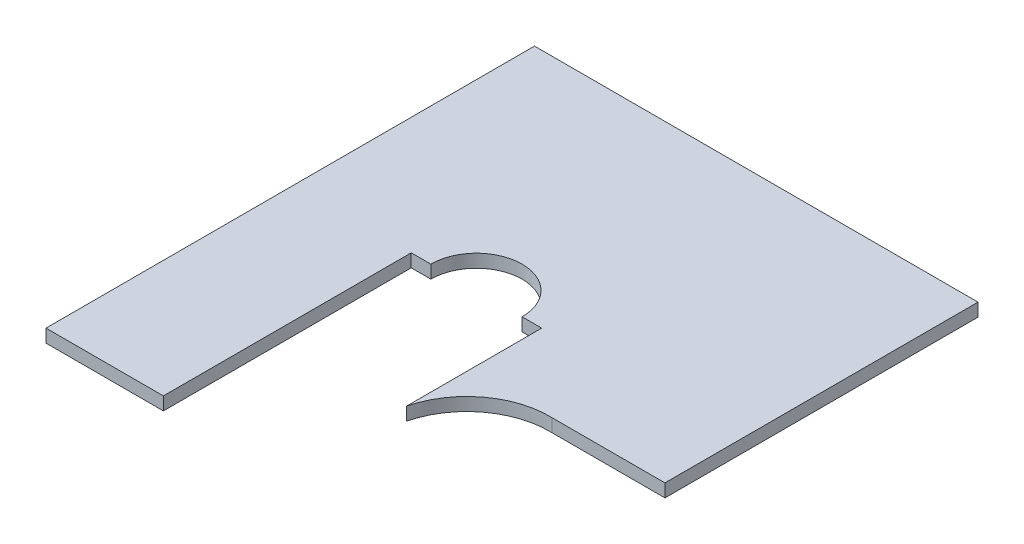
ISO-10303-21;
HEADER;
FILE_DESCRIPTION(('STEP AP214'),'2;1');
FILE_NAME('part.step','',(''),(''),'','','');
FILE_SCHEMA(('AUTOMOTIVE_DESIGN { 1 0 10303 214 1 1 1 1 }'));
ENDSEC;
DATA;
#1=APPLICATION_CONTEXT('core data for automotive mechanical design processes');
#2=APPLICATION_PROTOCOL_DEFINITION('international standard','automotive_design',2000,#1);
#3=PRODUCT_CONTEXT('',#1,'mechanical');
#4=PRODUCT('Part','Part','',(#3));
#5=PRODUCT_RELATED_PRODUCT_CATEGORY('part','',(#4));
#6=PRODUCT_DEFINITION_FORMATION('','',#4);
#7=PRODUCT_DEFINITION_CONTEXT('part definition',#1,'design');
#8=PRODUCT_DEFINITION('design','',#6,#7);
#9=PRODUCT_DEFINITION_SHAPE('','',#8);
#10=(LENGTH_UNIT() NAMED_UNIT(*) SI_UNIT(.MILLI.,.METRE.));
#11=(NAMED_UNIT(*) PLANE_ANGLE_UNIT() SI_UNIT($,.RADIAN.));
#12=(NAMED_UNIT(*) SI_UNIT($,.STERADIAN.) SOLID_ANGLE_UNIT());
#13=UNCERTAINTY_MEASURE_WITH_UNIT(LENGTH_MEASURE(1.E-05),#10,'distance_accuracy_value','');
#14=(GEOMETRIC_REPRESENTATION_CONTEXT(3) GLOBAL_UNCERTAINTY_ASSIGNED_CONTEXT((#13)) GLOBAL_UNIT_ASSIGNED_CONTEXT((#10,
#11,#12)) REPRESENTATION_CONTEXT('',''));
#15=CARTESIAN_POINT('',(0.,0.,0.));
#16=DIRECTION('',(0.,0.,1.));
#17=DIRECTION('',(1.,0.,0.));
#18=AXIS2_PLACEMENT_3D('',#15,#16,#17);
#19=CARTESIAN_POINT('',(-8.02288626733294,0.25,-28.8935870349217));
#20=DIRECTION('',(0.,-1.,0.));
#21=DIRECTION('',(0.,0.,-1.));
#22=AXIS2_PLACEMENT_3D('',#19,#20,#21);
#23=CYLINDRICAL_SURFACE('',#22,1.75);
#24=CARTESIAN_POINT('',(-8.02288626733294,-0.25,-28.8935870349217));
#25=DIRECTION('',(0.,-1.,0.));
#26=DIRECTION('',(0.,0.,1.));
#27=AXIS2_PLACEMENT_3D('',#24,#25,#26);
#28=CIRCLE('',#27,1.75);
#29=CARTESIAN_POINT('',(-9.77288626733294,-0.25,-28.8935870349217));
#30=VERTEX_POINT('',#29);
#31=CARTESIAN_POINT('',(-6.27288626733294,-0.25,-28.8935870349217));
#32=VERTEX_POINT('',#31);
#33=EDGE_CURVE('E158',#30,#32,#28,.T.);
#34=ORIENTED_EDGE('',*,*,#33,.T.);
#35=DIRECTION('',(0.,-1.,0.));
#36=VECTOR('',#35,1.);
#37=CARTESIAN_POINT('',(-6.27288626733294,0.25,-28.8935870349217));
#38=LINE('',#37,#36);
#39=CARTESIAN_POINT('',(-6.27288626733294,0.25,-28.8935870349217));
#40=VERTEX_POINT('',#39);
#41=EDGE_CURVE('E11',#40,#32,#38,.T.);
#42=ORIENTED_EDGE('',*,*,#41,.F.);
#43=CARTESIAN_POINT('',(-8.02288626733294,0.25,-28.8935870349217));
#44=DIRECTION('',(0.,-1.,0.));
#45=DIRECTION('',(0.,0.,1.));
#46=AXIS2_PLACEMENT_3D('',#43,#44,#45);
#47=CIRCLE('',#46,1.75);
#48=CARTESIAN_POINT('',(-9.77288626733294,0.25,-28.8935870349217));
#49=VERTEX_POINT('',#48);
#50=EDGE_CURVE('E189',#49,#40,#47,.T.);
#51=ORIENTED_EDGE('',*,*,#50,.F.);
#52=DIRECTION('',(0.,-1.,0.));
#53=VECTOR('',#52,1.);
#54=CARTESIAN_POINT('',(-9.77288626733294,0.25,-28.8935870349217));
#55=LINE('',#54,#53);
#56=EDGE_CURVE('E154',#49,#30,#55,.T.);
#57=ORIENTED_EDGE('',*,*,#56,.T.);
#58=EDGE_LOOP('',(#34,#42,#51,#57));
#59=FACE_BOUND('',#58,.T.);
#60=ADVANCED_FACE('F39',(#59),#23,.F.);
#61=CARTESIAN_POINT('',(-6.27288626733294,0.25,-28.8935870349217));
#62=DIRECTION('',(0.,0.,-1.));
#63=DIRECTION('',(-1.,0.,0.));
#64=AXIS2_PLACEMENT_3D('',#61,#62,#63);
#65=PLANE('',#64);
#66=DIRECTION('',(1.,0.,0.));
#67=VECTOR('',#66,1.);
#68=CARTESIAN_POINT('',(-6.27288626733294,-0.25,-28.8935870349217));
#69=LINE('',#68,#67);
#70=CARTESIAN_POINT('',(-5.52288626733294,-0.25,-28.8935870349217));
#71=VERTEX_POINT('',#70);
#72=EDGE_CURVE('E162',#32,#71,#69,.T.);
#73=ORIENTED_EDGE('',*,*,#72,.T.);
#74=DIRECTION('',(0.,-1.,0.));
#75=VECTOR('',#74,1.);
#76=CARTESIAN_POINT('',(-5.52288626733294,0.25,-28.8935870349217));
#77=LINE('',#76,#75);
#78=CARTESIAN_POINT('',(-5.52288626733294,0.25,-28.8935870349217));
#79=VERTEX_POINT('',#78);
#80=EDGE_CURVE('E48',#79,#71,#77,.T.);
#81=ORIENTED_EDGE('',*,*,#80,.F.);
#82=DIRECTION('',(1.,0.,0.));
#83=VECTOR('',#82,1.);
#84=CARTESIAN_POINT('',(-6.27288626733294,0.25,-28.8935870349217));
#85=LINE('',#84,#83);
#86=EDGE_CURVE('E108',#40,#79,#85,.T.);
#87=ORIENTED_EDGE('',*,*,#86,.F.);
#88=ORIENTED_EDGE('',*,*,#41,.T.);
#89=EDGE_LOOP('',(#73,#81,#87,#88));
#90=FACE_BOUND('',#89,.T.);
#91=ADVANCED_FACE('F275',(#90),#65,.F.);
#92=CARTESIAN_POINT('',(-5.52288626733294,0.25,-28.8935870349217));
#93=DIRECTION('',(1.,0.,0.));
#94=DIRECTION('',(0.,0.,-1.));
#95=AXIS2_PLACEMENT_3D('',#92,#93,#94);
#96=PLANE('',#95);
#97=DIRECTION('',(0.,0.,1.));
#98=VECTOR('',#97,1.);
#99=CARTESIAN_POINT('',(-5.52288626733294,-0.25,-28.8935870349217));
#100=LINE('',#99,#98);
#101=CARTESIAN_POINT('',(-5.52288626733294,-0.25,-23.7185870349217));
#102=VERTEX_POINT('',#101);
#103=EDGE_CURVE('E165',#71,#102,#100,.T.);
#104=ORIENTED_EDGE('',*,*,#103,.T.);
#105=DIRECTION('',(0.,-1.,0.));
#106=VECTOR('',#105,1.);
#107=CARTESIAN_POINT('',(-5.52288626733294,0.25,-23.7185870349217));
#108=LINE('',#107,#106);
#109=CARTESIAN_POINT('',(-5.52288626733294,0.25,-23.7185870349217));
#110=VERTEX_POINT('',#109);
#111=EDGE_CURVE('E212',#110,#102,#108,.T.);
#112=ORIENTED_EDGE('',*,*,#111,.F.);
#113=DIRECTION('',(0.,0.,1.));
#114=VECTOR('',#113,1.);
#115=CARTESIAN_POINT('',(-5.52288626733294,0.25,-28.8935870349217));
#116=LINE('',#115,#114);
#117=EDGE_CURVE('E222',#79,#110,#116,.T.);
#118=ORIENTED_EDGE('',*,*,#117,.F.);
#119=ORIENTED_EDGE('',*,*,#80,.T.);
#120=EDGE_LOOP('',(#104,#112,#118,#119));
#121=FACE_BOUND('',#120,.T.);
#122=ADVANCED_FACE('F220',(#121),#96,.F.);
#123=CARTESIAN_POINT('',(-2.44352375226658,0.25,-22.9451844872118));
#124=DIRECTION('',(0.,-1.,0.));
#125=DIRECTION('',(0.,0.,-1.));
#126=AXIS2_PLACEMENT_3D('',#123,#124,#125);
#127=CYLINDRICAL_SURFACE('',#126,3.175);
#128=CARTESIAN_POINT('',(-2.44352375226658,-0.25,-22.9451844872118));
#129=DIRECTION('',(0.,-1.,0.));
#130=DIRECTION('',(0.,0.,1.));
#131=AXIS2_PLACEMENT_3D('',#128,#129,#130);
#132=CIRCLE('',#131,3.175);
#133=CARTESIAN_POINT('',(-2.34788626733293,-0.25,-26.1187437621388));
#134=VERTEX_POINT('',#133);
#135=EDGE_CURVE('E168',#102,#134,#132,.T.);
#136=ORIENTED_EDGE('',*,*,#135,.T.);
#137=DIRECTION('',(0.,-1.,0.));
#138=VECTOR('',#137,1.);
#139=CARTESIAN_POINT('',(-2.34788626733293,0.25,-26.1187437621388));
#140=LINE('',#139,#138);
#141=CARTESIAN_POINT('',(-2.34788626733293,0.25,-26.1187437621388));
#142=VERTEX_POINT('',#141);
#143=EDGE_CURVE('E208',#142,#134,#140,.T.);
#144=ORIENTED_EDGE('',*,*,#143,.F.);
#145=CARTESIAN_POINT('',(-2.44352375226658,0.25,-22.9451844872118));
#146=DIRECTION('',(0.,-1.,0.));
#147=DIRECTION('',(0.,0.,1.));
#148=AXIS2_PLACEMENT_3D('',#145,#146,#147);
#149=CIRCLE('',#148,3.175);
#150=EDGE_CURVE('E241',#110,#142,#149,.T.);
#151=ORIENTED_EDGE('',*,*,#150,.F.);
#152=ORIENTED_EDGE('',*,*,#111,.T.);
#153=EDGE_LOOP('',(#136,#144,#151,#152));
#154=FACE_BOUND('',#153,.T.);
#155=ADVANCED_FACE('F231',(#154),#127,.F.);
#156=CARTESIAN_POINT('',(-2.34788626733293,0.25,-26.1187437621388));
#157=DIRECTION('',(0.,0.,-1.));
#158=DIRECTION('',(-1.,0.,0.));
#159=AXIS2_PLACEMENT_3D('',#156,#157,#158);
#160=PLANE('',#159);
#161=DIRECTION('',(1.,0.,0.));
#162=VECTOR('',#161,1.);
#163=CARTESIAN_POINT('',(-2.34788626733293,-0.25,-26.1187437621388));
#164=LINE('',#163,#162);
#165=CARTESIAN_POINT('',(1.97711373266706,-0.25,-26.1187437621388));
#166=VERTEX_POINT('',#165);
#167=EDGE_CURVE('E171',#134,#166,#164,.T.);
#168=ORIENTED_EDGE('',*,*,#167,.T.);
#169=DIRECTION('',(0.,-1.,0.));
#170=VECTOR('',#169,1.);
#171=CARTESIAN_POINT('',(1.97711373266706,0.25,-26.1187437621388));
#172=LINE('',#171,#170);
#173=CARTESIAN_POINT('',(1.97711373266706,0.25,-26.1187437621388));
#174=VERTEX_POINT('',#173);
#175=EDGE_CURVE('E204',#174,#166,#172,.T.);
#176=ORIENTED_EDGE('',*,*,#175,.F.);
#177=DIRECTION('',(1.,0.,0.));
#178=VECTOR('',#177,1.);
#179=CARTESIAN_POINT('',(-2.34788626733293,0.25,-26.1187437621388));
#180=LINE('',#179,#178);
#181=EDGE_CURVE('E237',#142,#174,#180,.T.);
#182=ORIENTED_EDGE('',*,*,#181,.F.);
#183=ORIENTED_EDGE('',*,*,#143,.T.);
#184=EDGE_LOOP('',(#168,#176,#182,#183));
#185=FACE_BOUND('',#184,.T.);
#186=ADVANCED_FACE('F235',(#185),#160,.F.);
#187=CARTESIAN_POINT('',(1.97711373266706,0.25,-26.1187437621388));
#188=DIRECTION('',(-1.,0.,0.));
#189=DIRECTION('',(0.,0.,1.));
#190=AXIS2_PLACEMENT_3D('',#187,#188,#189);
#191=PLANE('',#190);
#192=DIRECTION('',(0.,0.,-1.));
#193=VECTOR('',#192,1.);
#194=CARTESIAN_POINT('',(1.97711373266706,-0.25,-26.1187437621388));
#195=LINE('',#194,#193);
#196=CARTESIAN_POINT('',(1.97711373266706,-0.25,-38.1187437621388));
#197=VERTEX_POINT('',#196);
#198=EDGE_CURVE('E174',#166,#197,#195,.T.);
#199=ORIENTED_EDGE('',*,*,#198,.T.);
#200=DIRECTION('',(0.,-1.,0.));
#201=VECTOR('',#200,1.);
#202=CARTESIAN_POINT('',(1.97711373266706,0.25,-38.1187437621388));
#203=LINE('',#202,#201);
#204=CARTESIAN_POINT('',(1.97711373266706,0.25,-38.1187437621388));
#205=VERTEX_POINT('',#204);
#206=EDGE_CURVE('E200',#205,#197,#203,.T.);
#207=ORIENTED_EDGE('',*,*,#206,.F.);
#208=DIRECTION('',(0.,0.,-1.));
#209=VECTOR('',#208,1.);
#210=CARTESIAN_POINT('',(1.97711373266706,0.25,-26.1187437621388));
#211=LINE('',#210,#209);
#212=EDGE_CURVE('E240',#174,#205,#211,.T.);
#213=ORIENTED_EDGE('',*,*,#212,.F.);
#214=ORIENTED_EDGE('',*,*,#175,.T.);
#215=EDGE_LOOP('',(#199,#207,#213,#214));
#216=FACE_BOUND('',#215,.T.);
#217=ADVANCED_FACE('F288',(#216),#191,.F.);
#218=CARTESIAN_POINT('',(1.97711373266706,0.25,-38.1187437621388));
#219=DIRECTION('',(0.,0.,1.));
#220=DIRECTION('',(1.,0.,0.));
#221=AXIS2_PLACEMENT_3D('',#218,#219,#220);
#222=PLANE('',#221);
#223=DIRECTION('',(-1.,0.,0.));
#224=VECTOR('',#223,1.);
#225=CARTESIAN_POINT('',(1.97711373266706,-0.25,-38.1187437621388));
#226=LINE('',#225,#224);
#227=CARTESIAN_POINT('',(-15.0228862673329,-0.25,-38.1187437621388));
#228=VERTEX_POINT('',#227);
#229=EDGE_CURVE('E177',#197,#228,#226,.T.);
#230=ORIENTED_EDGE('',*,*,#229,.T.);
#231=DIRECTION('',(0.,-1.,0.));
#232=VECTOR('',#231,1.);
#233=CARTESIAN_POINT('',(-15.0228862673329,0.25,-38.1187437621388));
#234=LINE('',#233,#232);
#235=CARTESIAN_POINT('',(-15.0228862673329,0.25,-38.1187437621388));
#236=VERTEX_POINT('',#235);
#237=EDGE_CURVE('E196',#236,#228,#234,.T.);
#238=ORIENTED_EDGE('',*,*,#237,.F.);
#239=DIRECTION('',(-1.,0.,0.));
#240=VECTOR('',#239,1.);
#241=CARTESIAN_POINT('',(1.97711373266706,0.25,-38.1187437621388));
#242=LINE('',#241,#240);
#243=EDGE_CURVE('E245',#205,#236,#242,.T.);
#244=ORIENTED_EDGE('',*,*,#243,.F.);
#245=ORIENTED_EDGE('',*,*,#206,.T.);
#246=EDGE_LOOP('',(#230,#238,#244,#245));
#247=FACE_BOUND('',#246,.T.);
#248=ADVANCED_FACE('F256',(#247),#222,.F.);
#249=CARTESIAN_POINT('',(-15.0228862673329,0.25,-38.1187437621388));
#250=DIRECTION('',(1.,0.,0.));
#251=DIRECTION('',(0.,0.,-1.));
#252=AXIS2_PLACEMENT_3D('',#249,#250,#251);
#253=PLANE('',#252);
#254=DIRECTION('',(0.,0.,1.));
#255=VECTOR('',#254,1.);
#256=CARTESIAN_POINT('',(-15.0228862673329,-0.25,-38.1187437621388));
#257=LINE('',#256,#255);
#258=CARTESIAN_POINT('',(-15.0228862673329,-0.25,-19.3935870349217));
#259=VERTEX_POINT('',#258);
#260=EDGE_CURVE('E180',#228,#259,#257,.T.);
#261=ORIENTED_EDGE('',*,*,#260,.T.);
#262=DIRECTION('',(0.,-1.,0.));
#263=VECTOR('',#262,1.);
#264=CARTESIAN_POINT('',(-15.0228862673329,0.25,-19.3935870349217));
#265=LINE('',#264,#263);
#266=CARTESIAN_POINT('',(-15.0228862673329,0.25,-19.3935870349217));
#267=VERTEX_POINT('',#266);
#268=EDGE_CURVE('E147',#267,#259,#265,.T.);
#269=ORIENTED_EDGE('',*,*,#268,.F.);
#270=DIRECTION('',(0.,0.,1.));
#271=VECTOR('',#270,1.);
#272=CARTESIAN_POINT('',(-15.0228862673329,0.25,-38.1187437621388));
#273=LINE('',#272,#271);
#274=EDGE_CURVE('E136',#236,#267,#273,.T.);
#275=ORIENTED_EDGE('',*,*,#274,.F.);
#276=ORIENTED_EDGE('',*,*,#237,.T.);
#277=EDGE_LOOP('',(#261,#269,#275,#276));
#278=FACE_BOUND('',#277,.T.);
#279=ADVANCED_FACE('F260',(#278),#253,.F.);
#280=CARTESIAN_POINT('',(-10.5228862673329,0.25,-19.3935870349217));
#281=DIRECTION('',(0.,0.,-1.));
#282=DIRECTION('',(-1.,0.,0.));
#283=AXIS2_PLACEMENT_3D('',#280,#281,#282);
#284=PLANE('',#283);
#285=DIRECTION('',(1.,0.,0.));
#286=VECTOR('',#285,1.);
#287=CARTESIAN_POINT('',(-10.5228862673329,-0.25,-19.3935870349217));
#288=LINE('',#287,#286);
#289=CARTESIAN_POINT('',(-10.5228862673329,-0.25,-19.3935870349217));
#290=VERTEX_POINT('',#289);
#291=EDGE_CURVE('E145',#259,#290,#288,.T.);
#292=ORIENTED_EDGE('',*,*,#291,.T.);
#293=DIRECTION('',(0.,-1.,0.));
#294=VECTOR('',#293,1.);
#295=CARTESIAN_POINT('',(-10.5228862673329,0.25,-19.3935870349217));
#296=LINE('',#295,#294);
#297=CARTESIAN_POINT('',(-10.5228862673329,0.25,-19.3935870349217));
#298=VERTEX_POINT('',#297);
#299=EDGE_CURVE('E142',#298,#290,#296,.T.);
#300=ORIENTED_EDGE('',*,*,#299,.F.);
#301=DIRECTION('',(1.,0.,0.));
#302=VECTOR('',#301,1.);
#303=CARTESIAN_POINT('',(-10.5228862673329,0.25,-19.3935870349217));
#304=LINE('',#303,#302);
#305=EDGE_CURVE('E130',#267,#298,#304,.T.);
#306=ORIENTED_EDGE('',*,*,#305,.F.);
#307=ORIENTED_EDGE('',*,*,#268,.T.);
#308=EDGE_LOOP('',(#292,#300,#306,#307));
#309=FACE_BOUND('',#308,.T.);
#310=ADVANCED_FACE('F143',(#309),#284,.F.);
#311=CARTESIAN_POINT('',(-10.5228862673329,0.25,-28.8935870349217));
#312=DIRECTION('',(-1.,0.,0.));
#313=DIRECTION('',(0.,0.,1.));
#314=AXIS2_PLACEMENT_3D('',#311,#312,#313);
#315=PLANE('',#314);
#316=DIRECTION('',(0.,0.,-1.));
#317=VECTOR('',#316,1.);
#318=CARTESIAN_POINT('',(-10.5228862673329,-0.25,-28.8935870349217));
#319=LINE('',#318,#317);
#320=CARTESIAN_POINT('',(-10.5228862673329,-0.25,-28.8935870349217));
#321=VERTEX_POINT('',#320);
#322=EDGE_CURVE('E94',#290,#321,#319,.T.);
#323=ORIENTED_EDGE('',*,*,#322,.T.);
#324=DIRECTION('',(0.,-1.,0.));
#325=VECTOR('',#324,1.);
#326=CARTESIAN_POINT('',(-10.5228862673329,0.25,-28.8935870349217));
#327=LINE('',#326,#325);
#328=CARTESIAN_POINT('',(-10.5228862673329,0.25,-28.8935870349217));
#329=VERTEX_POINT('',#328);
#330=EDGE_CURVE('E148',#329,#321,#327,.T.);
#331=ORIENTED_EDGE('',*,*,#330,.F.);
#332=DIRECTION('',(0.,0.,-1.));
#333=VECTOR('',#332,1.);
#334=CARTESIAN_POINT('',(-10.5228862673329,0.25,-28.8935870349217));
#335=LINE('',#334,#333);
#336=EDGE_CURVE('E134',#298,#329,#335,.T.);
#337=ORIENTED_EDGE('',*,*,#336,.F.);
#338=ORIENTED_EDGE('',*,*,#299,.T.);
#339=EDGE_LOOP('',(#323,#331,#337,#338));
#340=FACE_BOUND('',#339,.T.);
#341=ADVANCED_FACE('F150',(#340),#315,.F.);
#342=CARTESIAN_POINT('',(-10.5228862673329,0.25,-28.8935870349217));
#343=DIRECTION('',(0.,0.,-1.));
#344=DIRECTION('',(-1.,0.,0.));
#345=AXIS2_PLACEMENT_3D('',#342,#343,#344);
#346=PLANE('',#345);
#347=DIRECTION('',(1.,0.,0.));
#348=VECTOR('',#347,1.);
#349=CARTESIAN_POINT('',(-10.5228862673329,-0.25,-28.8935870349217));
#350=LINE('',#349,#348);
#351=EDGE_CURVE('E100',#321,#30,#350,.T.);
#352=ORIENTED_EDGE('',*,*,#351,.T.);
#353=ORIENTED_EDGE('',*,*,#56,.F.);
#354=DIRECTION('',(1.,0.,0.));
#355=VECTOR('',#354,1.);
#356=CARTESIAN_POINT('',(-10.5228862673329,0.25,-28.8935870349217));
#357=LINE('',#356,#355);
#358=EDGE_CURVE('E56',#329,#49,#357,.T.);
#359=ORIENTED_EDGE('',*,*,#358,.F.);
#360=ORIENTED_EDGE('',*,*,#330,.T.);
#361=EDGE_LOOP('',(#352,#353,#359,#360));
#362=FACE_BOUND('',#361,.T.);
#363=ADVANCED_FACE('F264',(#362),#346,.F.);
#364=CARTESIAN_POINT('',(-8.02288626733294,0.25,-28.8935870349217));
#365=DIRECTION('',(0.,1.,0.));
#366=DIRECTION('',(0.,0.,1.));
#367=AXIS2_PLACEMENT_3D('',#364,#365,#366);
#368=PLANE('',#367);
#369=ORIENTED_EDGE('',*,*,#50,.T.);
#370=ORIENTED_EDGE('',*,*,#86,.T.);
#371=ORIENTED_EDGE('',*,*,#117,.T.);
#372=ORIENTED_EDGE('',*,*,#150,.T.);
#373=ORIENTED_EDGE('',*,*,#181,.T.);
#374=ORIENTED_EDGE('',*,*,#212,.T.);
#375=ORIENTED_EDGE('',*,*,#243,.T.);
#376=ORIENTED_EDGE('',*,*,#274,.T.);
#377=ORIENTED_EDGE('',*,*,#305,.T.);
#378=ORIENTED_EDGE('',*,*,#336,.T.);
#379=ORIENTED_EDGE('',*,*,#358,.T.);
#380=EDGE_LOOP('',(#369,#370,#371,#372,#373,#374,#375,#376,#377,#378,#379));
#381=FACE_BOUND('',#380,.T.);
#382=ADVANCED_FACE('F132',(#381),#368,.T.);
#383=CARTESIAN_POINT('',(-8.02288626733294,-0.25,-28.8935870349217));
#384=DIRECTION('',(0.,1.,0.));
#385=DIRECTION('',(0.,0.,1.));
#386=AXIS2_PLACEMENT_3D('',#383,#384,#385);
#387=PLANE('',#386);
#388=ORIENTED_EDGE('',*,*,#33,.F.);
#389=ORIENTED_EDGE('',*,*,#351,.F.);
#390=ORIENTED_EDGE('',*,*,#322,.F.);
#391=ORIENTED_EDGE('',*,*,#291,.F.);
#392=ORIENTED_EDGE('',*,*,#260,.F.);
#393=ORIENTED_EDGE('',*,*,#229,.F.);
#394=ORIENTED_EDGE('',*,*,#198,.F.);
#395=ORIENTED_EDGE('',*,*,#167,.F.);
#396=ORIENTED_EDGE('',*,*,#135,.F.);
#397=ORIENTED_EDGE('',*,*,#103,.F.);
#398=ORIENTED_EDGE('',*,*,#72,.F.);
#399=EDGE_LOOP('',(#388,#389,#390,#391,#392,#393,#394,#395,#396,#397,#398));
#400=FACE_BOUND('',#399,.T.);
#401=ADVANCED_FACE('F226',(#400),#387,.F.);
#402=CLOSED_SHELL('',(#60,#91,#122,#155,#186,#217,#248,#279,#310,#341,#363,#382,#401));
#403=MANIFOLD_SOLID_BREP('B2',#402);
#404=ADVANCED_BREP_SHAPE_REPRESENTATION('',(#18,#403),#14);
#405=SHAPE_DEFINITION_REPRESENTATION(#9,#404);
ENDSEC;
END-ISO-10303-21;
